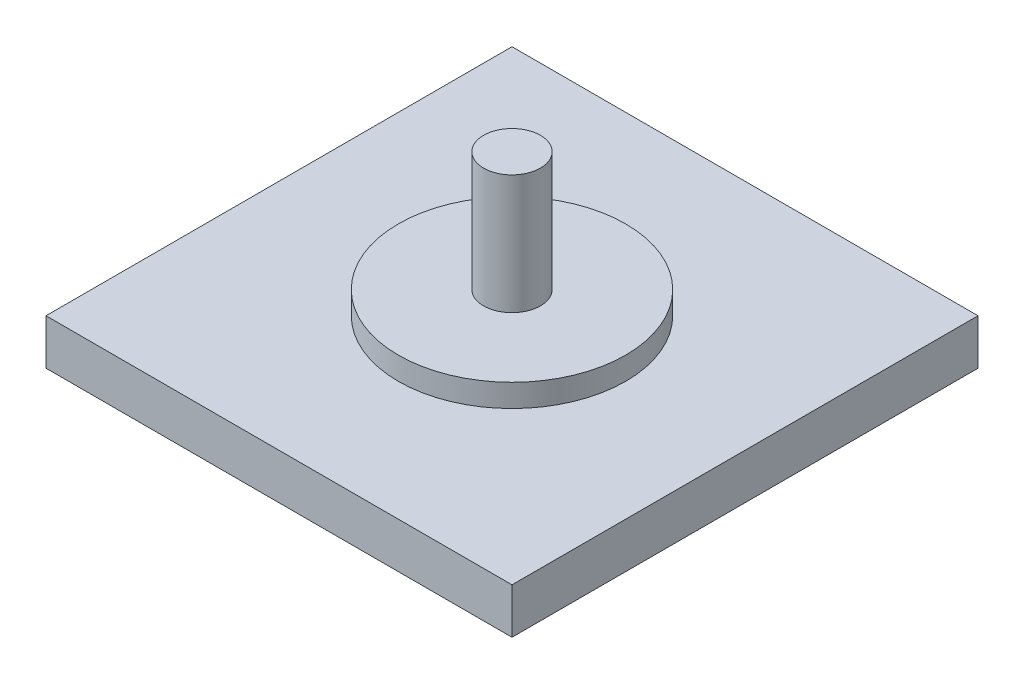
ISO-10303-21;
HEADER;
FILE_DESCRIPTION(('STEP AP214'),'2;1');
FILE_NAME('part.step','',(''),(''),'','','');
FILE_SCHEMA(('AUTOMOTIVE_DESIGN { 1 0 10303 214 1 1 1 1 }'));
ENDSEC;
DATA;
#1=APPLICATION_CONTEXT('core data for automotive mechanical design processes');
#2=APPLICATION_PROTOCOL_DEFINITION('international standard','automotive_design',2000,#1);
#3=PRODUCT_CONTEXT('',#1,'mechanical');
#4=PRODUCT('Part','Part','',(#3));
#5=PRODUCT_RELATED_PRODUCT_CATEGORY('part','',(#4));
#6=PRODUCT_DEFINITION_FORMATION('','',#4);
#7=PRODUCT_DEFINITION_CONTEXT('part definition',#1,'design');
#8=PRODUCT_DEFINITION('design','',#6,#7);
#9=PRODUCT_DEFINITION_SHAPE('','',#8);
#10=(LENGTH_UNIT() NAMED_UNIT(*) SI_UNIT(.MILLI.,.METRE.));
#11=(NAMED_UNIT(*) PLANE_ANGLE_UNIT() SI_UNIT($,.RADIAN.));
#12=(NAMED_UNIT(*) SI_UNIT($,.STERADIAN.) SOLID_ANGLE_UNIT());
#13=UNCERTAINTY_MEASURE_WITH_UNIT(LENGTH_MEASURE(1.E-05),#10,'distance_accuracy_value','');
#14=(GEOMETRIC_REPRESENTATION_CONTEXT(3) GLOBAL_UNCERTAINTY_ASSIGNED_CONTEXT((#13)) GLOBAL_UNIT_ASSIGNED_CONTEXT((#10,
#11,#12)) REPRESENTATION_CONTEXT('',''));
#15=CARTESIAN_POINT('',(0.,0.,0.));
#16=DIRECTION('',(0.,0.,1.));
#17=DIRECTION('',(1.,0.,0.));
#18=AXIS2_PLACEMENT_3D('',#15,#16,#17);
#19=CARTESIAN_POINT('',(20.5,4.,20.5));
#20=DIRECTION('',(-1.,0.,0.));
#21=DIRECTION('',(0.,0.,1.));
#22=AXIS2_PLACEMENT_3D('',#19,#20,#21);
#23=PLANE('',#22);
#24=DIRECTION('',(0.,0.,-1.));
#25=VECTOR('',#24,1.);
#26=CARTESIAN_POINT('',(20.5,0.,20.5));
#27=LINE('',#26,#25);
#28=CARTESIAN_POINT('',(20.5,0.,20.5));
#29=VERTEX_POINT('',#28);
#30=CARTESIAN_POINT('',(20.5,0.,-20.5));
#31=VERTEX_POINT('',#30);
#32=EDGE_CURVE('E102',#29,#31,#27,.T.);
#33=ORIENTED_EDGE('',*,*,#32,.T.);
#34=DIRECTION('',(0.,-1.,0.));
#35=VECTOR('',#34,1.);
#36=CARTESIAN_POINT('',(20.5,4.,-20.5));
#37=LINE('',#36,#35);
#38=CARTESIAN_POINT('',(20.5,4.,-20.5));
#39=VERTEX_POINT('',#38);
#40=EDGE_CURVE('E38',#39,#31,#37,.T.);
#41=ORIENTED_EDGE('',*,*,#40,.F.);
#42=DIRECTION('',(0.,0.,-1.));
#43=VECTOR('',#42,1.);
#44=CARTESIAN_POINT('',(20.5,4.,20.5));
#45=LINE('',#44,#43);
#46=CARTESIAN_POINT('',(20.5,4.,20.5));
#47=VERTEX_POINT('',#46);
#48=EDGE_CURVE('E89',#47,#39,#45,.T.);
#49=ORIENTED_EDGE('',*,*,#48,.F.);
#50=DIRECTION('',(0.,-1.,0.));
#51=VECTOR('',#50,1.);
#52=CARTESIAN_POINT('',(20.5,4.,20.5));
#53=LINE('',#52,#51);
#54=EDGE_CURVE('E98',#47,#29,#53,.T.);
#55=ORIENTED_EDGE('',*,*,#54,.T.);
#56=EDGE_LOOP('',(#33,#41,#49,#55));
#57=FACE_BOUND('',#56,.T.);
#58=ADVANCED_FACE('F35',(#57),#23,.F.);
#59=CARTESIAN_POINT('',(-20.5,4.,-20.5));
#60=DIRECTION('',(0.,0.,1.));
#61=DIRECTION('',(1.,0.,0.));
#62=AXIS2_PLACEMENT_3D('',#59,#60,#61);
#63=PLANE('',#62);
#64=DIRECTION('',(-1.,0.,0.));
#65=VECTOR('',#64,1.);
#66=CARTESIAN_POINT('',(-20.5,0.,-20.5));
#67=LINE('',#66,#65);
#68=CARTESIAN_POINT('',(-20.5,0.,-20.5));
#69=VERTEX_POINT('',#68);
#70=EDGE_CURVE('E94',#31,#69,#67,.T.);
#71=ORIENTED_EDGE('',*,*,#70,.T.);
#72=DIRECTION('',(0.,-1.,0.));
#73=VECTOR('',#72,1.);
#74=CARTESIAN_POINT('',(-20.5,4.,-20.5));
#75=LINE('',#74,#73);
#76=CARTESIAN_POINT('',(-20.5,4.,-20.5));
#77=VERTEX_POINT('',#76);
#78=EDGE_CURVE('E92',#77,#69,#75,.T.);
#79=ORIENTED_EDGE('',*,*,#78,.F.);
#80=DIRECTION('',(-1.,0.,0.));
#81=VECTOR('',#80,1.);
#82=CARTESIAN_POINT('',(-20.5,4.,-20.5));
#83=LINE('',#82,#81);
#84=EDGE_CURVE('E84',#39,#77,#83,.T.);
#85=ORIENTED_EDGE('',*,*,#84,.F.);
#86=ORIENTED_EDGE('',*,*,#40,.T.);
#87=EDGE_LOOP('',(#71,#79,#85,#86));
#88=FACE_BOUND('',#87,.T.);
#89=ADVANCED_FACE('F93',(#88),#63,.F.);
#90=CARTESIAN_POINT('',(-20.5,4.,20.5));
#91=DIRECTION('',(1.,0.,0.));
#92=DIRECTION('',(0.,0.,-1.));
#93=AXIS2_PLACEMENT_3D('',#90,#91,#92);
#94=PLANE('',#93);
#95=DIRECTION('',(0.,0.,1.));
#96=VECTOR('',#95,1.);
#97=CARTESIAN_POINT('',(-20.5,0.,20.5));
#98=LINE('',#97,#96);
#99=CARTESIAN_POINT('',(-20.5,0.,20.5));
#100=VERTEX_POINT('',#99);
#101=EDGE_CURVE('E70',#69,#100,#98,.T.);
#102=ORIENTED_EDGE('',*,*,#101,.T.);
#103=DIRECTION('',(0.,-1.,0.));
#104=VECTOR('',#103,1.);
#105=CARTESIAN_POINT('',(-20.5,4.,20.5));
#106=LINE('',#105,#104);
#107=CARTESIAN_POINT('',(-20.5,4.,20.5));
#108=VERTEX_POINT('',#107);
#109=EDGE_CURVE('E95',#108,#100,#106,.T.);
#110=ORIENTED_EDGE('',*,*,#109,.F.);
#111=DIRECTION('',(0.,0.,1.));
#112=VECTOR('',#111,1.);
#113=CARTESIAN_POINT('',(-20.5,4.,20.5));
#114=LINE('',#113,#112);
#115=EDGE_CURVE('E87',#77,#108,#114,.T.);
#116=ORIENTED_EDGE('',*,*,#115,.F.);
#117=ORIENTED_EDGE('',*,*,#78,.T.);
#118=EDGE_LOOP('',(#102,#110,#116,#117));
#119=FACE_BOUND('',#118,.T.);
#120=ADVANCED_FACE('F96',(#119),#94,.F.);
#121=CARTESIAN_POINT('',(-20.5,4.,20.5));
#122=DIRECTION('',(0.,0.,-1.));
#123=DIRECTION('',(-1.,0.,0.));
#124=AXIS2_PLACEMENT_3D('',#121,#122,#123);
#125=PLANE('',#124);
#126=DIRECTION('',(1.,0.,0.));
#127=VECTOR('',#126,1.);
#128=CARTESIAN_POINT('',(-20.5,0.,20.5));
#129=LINE('',#128,#127);
#130=EDGE_CURVE('E76',#100,#29,#129,.T.);
#131=ORIENTED_EDGE('',*,*,#130,.T.);
#132=ORIENTED_EDGE('',*,*,#54,.F.);
#133=DIRECTION('',(1.,0.,0.));
#134=VECTOR('',#133,1.);
#135=CARTESIAN_POINT('',(-20.5,4.,20.5));
#136=LINE('',#135,#134);
#137=EDGE_CURVE('E53',#108,#47,#136,.T.);
#138=ORIENTED_EDGE('',*,*,#137,.F.);
#139=ORIENTED_EDGE('',*,*,#109,.T.);
#140=EDGE_LOOP('',(#131,#132,#138,#139));
#141=FACE_BOUND('',#140,.T.);
#142=ADVANCED_FACE('F110',(#141),#125,.F.);
#143=CARTESIAN_POINT('',(0.,4.,0.));
#144=DIRECTION('',(0.,-1.,0.));
#145=DIRECTION('',(0.,0.,-1.));
#146=AXIS2_PLACEMENT_3D('',#143,#144,#145);
#147=PLANE('',#146);
#148=CARTESIAN_POINT('',(0.,4.,0.));
#149=DIRECTION('',(0.,1.,0.));
#150=DIRECTION('',(0.,0.,1.));
#151=AXIS2_PLACEMENT_3D('',#148,#149,#150);
#152=CIRCLE('',#151,10.);
#153=CARTESIAN_POINT('',(0.,4.,10.));
#154=VERTEX_POINT('',#153);
#155=EDGE_CURVE('E44',#154,#154,#152,.T.);
#156=ORIENTED_EDGE('',*,*,#155,.F.);
#157=EDGE_LOOP('',(#156));
#158=FACE_BOUND('',#157,.T.);
#159=ORIENTED_EDGE('',*,*,#48,.T.);
#160=ORIENTED_EDGE('',*,*,#84,.T.);
#161=ORIENTED_EDGE('',*,*,#115,.T.);
#162=ORIENTED_EDGE('',*,*,#137,.T.);
#163=EDGE_LOOP('',(#159,#160,#161,#162));
#164=FACE_BOUND('',#163,.T.);
#165=ADVANCED_FACE('F85',(#158,#164),#147,.F.);
#166=CARTESIAN_POINT('',(0.,0.,0.));
#167=DIRECTION('',(0.,-1.,0.));
#168=DIRECTION('',(0.,0.,-1.));
#169=AXIS2_PLACEMENT_3D('',#166,#167,#168);
#170=PLANE('',#169);
#171=ORIENTED_EDGE('',*,*,#32,.F.);
#172=ORIENTED_EDGE('',*,*,#130,.F.);
#173=ORIENTED_EDGE('',*,*,#101,.F.);
#174=ORIENTED_EDGE('',*,*,#70,.F.);
#175=EDGE_LOOP('',(#171,#172,#173,#174));
#176=FACE_BOUND('',#175,.T.);
#177=ADVANCED_FACE('F113',(#176),#170,.T.);
#178=CARTESIAN_POINT('',(0.,6.,0.));
#179=DIRECTION('',(0.,-1.,0.));
#180=DIRECTION('',(0.,0.,-1.));
#181=AXIS2_PLACEMENT_3D('',#178,#179,#180);
#182=CYLINDRICAL_SURFACE('',#181,10.);
#183=CARTESIAN_POINT('',(0.,6.,0.));
#184=DIRECTION('',(0.,1.,0.));
#185=DIRECTION('',(0.,0.,1.));
#186=AXIS2_PLACEMENT_3D('',#183,#184,#185);
#187=CIRCLE('',#186,10.);
#188=CARTESIAN_POINT('',(0.,6.,10.));
#189=VERTEX_POINT('',#188);
#190=EDGE_CURVE('E105',#189,#189,#187,.T.);
#191=ORIENTED_EDGE('',*,*,#190,.F.);
#192=EDGE_LOOP('',(#191));
#193=FACE_BOUND('',#192,.T.);
#194=ORIENTED_EDGE('',*,*,#155,.T.);
#195=EDGE_LOOP('',(#194));
#196=FACE_BOUND('',#195,.T.);
#197=ADVANCED_FACE('F135',(#193,#196),#182,.T.);
#198=CARTESIAN_POINT('',(0.,6.,0.));
#199=DIRECTION('',(0.,1.,0.));
#200=DIRECTION('',(0.,0.,1.));
#201=AXIS2_PLACEMENT_3D('',#198,#199,#200);
#202=PLANE('',#201);
#203=CARTESIAN_POINT('',(0.,6.,0.));
#204=DIRECTION('',(0.,1.,0.));
#205=DIRECTION('',(0.,0.,1.));
#206=AXIS2_PLACEMENT_3D('',#203,#204,#205);
#207=CIRCLE('',#206,2.5);
#208=CARTESIAN_POINT('',(0.,6.,-2.5));
#209=VERTEX_POINT('',#208);
#210=EDGE_CURVE('E11',#209,#209,#207,.T.);
#211=ORIENTED_EDGE('',*,*,#210,.F.);
#212=EDGE_LOOP('',(#211));
#213=FACE_BOUND('',#212,.T.);
#214=ORIENTED_EDGE('',*,*,#190,.T.);
#215=EDGE_LOOP('',(#214));
#216=FACE_BOUND('',#215,.T.);
#217=ADVANCED_FACE('F129',(#213,#216),#202,.T.);
#218=CARTESIAN_POINT('',(0.,16.5,0.));
#219=DIRECTION('',(0.,-1.,0.));
#220=DIRECTION('',(0.,0.,-1.));
#221=AXIS2_PLACEMENT_3D('',#218,#219,#220);
#222=CYLINDRICAL_SURFACE('',#221,2.5);
#223=CARTESIAN_POINT('',(0.,16.5,0.));
#224=DIRECTION('',(0.,1.,0.));
#225=DIRECTION('',(0.,0.,1.));
#226=AXIS2_PLACEMENT_3D('',#223,#224,#225);
#227=CIRCLE('',#226,2.5);
#228=CARTESIAN_POINT('',(0.,16.5,-2.5));
#229=VERTEX_POINT('',#228);
#230=EDGE_CURVE('E119',#229,#229,#227,.T.);
#231=CARTESIAN_POINT('',(0.,16.5,-2.5));
#232=CARTESIAN_POINT('',(0.,16.390625,-2.5));
#233=CARTESIAN_POINT('',(0.,16.28125,-2.5));
#234=CARTESIAN_POINT('',(0.,16.0625,-2.5));
#235=CARTESIAN_POINT('',(0.,15.953125,-2.5));
#236=CARTESIAN_POINT('',(0.,15.734375,-2.5));
#237=CARTESIAN_POINT('',(0.,15.625,-2.5));
#238=CARTESIAN_POINT('',(0.,15.40625,-2.5));
#239=CARTESIAN_POINT('',(0.,15.296875,-2.5));
#240=CARTESIAN_POINT('',(0.,15.078125,-2.5));
#241=CARTESIAN_POINT('',(0.,14.96875,-2.5));
#242=CARTESIAN_POINT('',(0.,14.75,-2.5));
#243=CARTESIAN_POINT('',(0.,14.640625,-2.5));
#244=CARTESIAN_POINT('',(0.,14.421875,-2.5));
#245=CARTESIAN_POINT('',(0.,14.3125,-2.5));
#246=CARTESIAN_POINT('',(0.,14.09375,-2.5));
#247=CARTESIAN_POINT('',(0.,13.984375,-2.5));
#248=CARTESIAN_POINT('',(0.,13.765625,-2.5));
#249=CARTESIAN_POINT('',(0.,13.65625,-2.5));
#250=CARTESIAN_POINT('',(0.,13.4375,-2.5));
#251=CARTESIAN_POINT('',(0.,13.328125,-2.5));
#252=CARTESIAN_POINT('',(0.,13.109375,-2.5));
#253=CARTESIAN_POINT('',(0.,13.,-2.5));
#254=CARTESIAN_POINT('',(0.,12.78125,-2.5));
#255=CARTESIAN_POINT('',(0.,12.671875,-2.5));
#256=CARTESIAN_POINT('',(0.,12.453125,-2.5));
#257=CARTESIAN_POINT('',(0.,12.34375,-2.5));
#258=CARTESIAN_POINT('',(0.,12.125,-2.5));
#259=CARTESIAN_POINT('',(0.,12.015625,-2.5));
#260=CARTESIAN_POINT('',(0.,11.796875,-2.5));
#261=CARTESIAN_POINT('',(0.,11.6875,-2.5));
#262=CARTESIAN_POINT('',(0.,11.46875,-2.5));
#263=CARTESIAN_POINT('',(0.,11.359375,-2.5));
#264=CARTESIAN_POINT('',(0.,11.140625,-2.5));
#265=CARTESIAN_POINT('',(0.,11.03125,-2.5));
#266=CARTESIAN_POINT('',(0.,10.8125,-2.5));
#267=CARTESIAN_POINT('',(0.,10.703125,-2.5));
#268=CARTESIAN_POINT('',(0.,10.484375,-2.5));
#269=CARTESIAN_POINT('',(0.,10.375,-2.5));
#270=CARTESIAN_POINT('',(0.,10.15625,-2.5));
#271=CARTESIAN_POINT('',(0.,10.046875,-2.5));
#272=CARTESIAN_POINT('',(0.,9.828125,-2.5));
#273=CARTESIAN_POINT('',(0.,9.71875,-2.5));
#274=CARTESIAN_POINT('',(0.,9.5,-2.5));
#275=CARTESIAN_POINT('',(0.,9.390625,-2.5));
#276=CARTESIAN_POINT('',(0.,9.171875,-2.5));
#277=CARTESIAN_POINT('',(0.,9.0625,-2.5));
#278=CARTESIAN_POINT('',(0.,8.84375,-2.5));
#279=CARTESIAN_POINT('',(0.,8.734375,-2.5));
#280=CARTESIAN_POINT('',(0.,8.515625,-2.5));
#281=CARTESIAN_POINT('',(0.,8.40625,-2.5));
#282=CARTESIAN_POINT('',(0.,8.1875,-2.5));
#283=CARTESIAN_POINT('',(0.,8.078125,-2.5));
#284=CARTESIAN_POINT('',(0.,7.859375,-2.5));
#285=CARTESIAN_POINT('',(0.,7.75,-2.5));
#286=CARTESIAN_POINT('',(0.,7.53125,-2.5));
#287=CARTESIAN_POINT('',(0.,7.421875,-2.5));
#288=CARTESIAN_POINT('',(0.,7.203125,-2.5));
#289=CARTESIAN_POINT('',(0.,7.09375,-2.5));
#290=CARTESIAN_POINT('',(0.,6.875,-2.5));
#291=CARTESIAN_POINT('',(0.,6.765625,-2.5));
#292=CARTESIAN_POINT('',(0.,6.546875,-2.5));
#293=CARTESIAN_POINT('',(0.,6.4375,-2.5));
#294=CARTESIAN_POINT('',(0.,6.21875,-2.5));
#295=CARTESIAN_POINT('',(0.,6.109375,-2.5));
#296=CARTESIAN_POINT('',(0.,6.,-2.5));
#297=B_SPLINE_CURVE_WITH_KNOTS('',3,(#231,#232,#233,#234,#235,#236,#237,#238,#239,#240,#241,
#242,#243,#244,#245,#246,#247,#248,#249,#250,#251,#252,#253,#254,#255,#256,#257,#258,#259,#260,
#261,#262,#263,#264,#265,#266,#267,#268,#269,#270,#271,#272,#273,#274,#275,#276,#277,#278,#279,
#280,#281,#282,#283,#284,#285,#286,#287,#288,#289,#290,#291,#292,#293,#294,#295,#296),
.UNSPECIFIED.,.F.,.F.,(4,2,2,2,2,2,2,2,2,2,2,2,2,2,2,2,2,2,2,2,2,2,2,2,2,2,2,2,2,2,2,2,4),(0.,
0.328124999999999,0.656249999999997,0.984374999999997,1.3125,1.640625,1.96875,2.296875,2.625,
2.953125,3.28125,3.609375,3.9375,4.265625,4.59375,4.921875,5.25,5.578125,5.90625,6.234375,
6.5625,6.890625,7.21875,7.546875,7.875,8.203125,8.53125,8.859375,9.1875,9.515625,9.84375,
10.171875,10.5),.UNSPECIFIED.);
#298=EDGE_CURVE('BSEAM126',#229,#209,#297,.T.);
#299=ORIENTED_EDGE('',*,*,#230,.F.);
#300=ORIENTED_EDGE('',*,*,#210,.T.);
#301=ORIENTED_EDGE('',*,*,#298,.T.);
#302=ORIENTED_EDGE('',*,*,#298,.F.);
#303=EDGE_LOOP('',(#299,#301,#300,#302));
#304=FACE_BOUND('',#303,.T.);
#305=ADVANCED_FACE('F126',(#304),#222,.T.);
#306=CARTESIAN_POINT('',(0.,16.5,0.));
#307=DIRECTION('',(0.,1.,0.));
#308=DIRECTION('',(0.,0.,1.));
#309=AXIS2_PLACEMENT_3D('',#306,#307,#308);
#310=PLANE('',#309);
#311=ORIENTED_EDGE('',*,*,#230,.T.);
#312=EDGE_LOOP('',(#311));
#313=FACE_BOUND('',#312,.T.);
#314=ADVANCED_FACE('F124',(#313),#310,.T.);
#315=CLOSED_SHELL('',(#58,#89,#120,#142,#165,#177,#197,#217,#305,#314));
#316=MANIFOLD_SOLID_BREP('B2',#315);
#317=ADVANCED_BREP_SHAPE_REPRESENTATION('',(#18,#316),#14);
#318=SHAPE_DEFINITION_REPRESENTATION(#9,#317);
ENDSEC;
END-ISO-10303-21;
